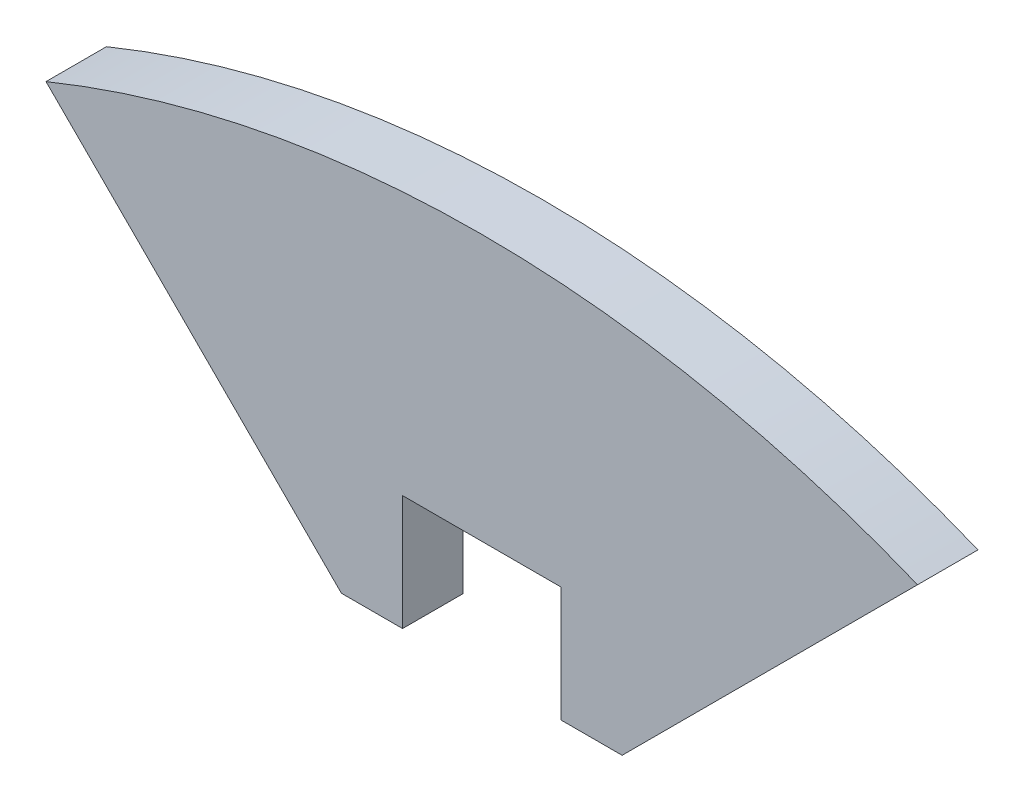
ISO-10303-21;
HEADER;
FILE_DESCRIPTION(('STEP AP214'),'2;1');
FILE_NAME('part.step','',(''),(''),'','','');
FILE_SCHEMA(('AUTOMOTIVE_DESIGN { 1 0 10303 214 1 1 1 1 }'));
ENDSEC;
DATA;
#1=APPLICATION_CONTEXT('core data for automotive mechanical design processes');
#2=APPLICATION_PROTOCOL_DEFINITION('international standard','automotive_design',2000,#1);
#3=PRODUCT_CONTEXT('',#1,'mechanical');
#4=PRODUCT('Part','Part','',(#3));
#5=PRODUCT_RELATED_PRODUCT_CATEGORY('part','',(#4));
#6=PRODUCT_DEFINITION_FORMATION('','',#4);
#7=PRODUCT_DEFINITION_CONTEXT('part definition',#1,'design');
#8=PRODUCT_DEFINITION('design','',#6,#7);
#9=PRODUCT_DEFINITION_SHAPE('','',#8);
#10=(LENGTH_UNIT() NAMED_UNIT(*) SI_UNIT(.MILLI.,.METRE.));
#11=(NAMED_UNIT(*) PLANE_ANGLE_UNIT() SI_UNIT($,.RADIAN.));
#12=(NAMED_UNIT(*) SI_UNIT($,.STERADIAN.) SOLID_ANGLE_UNIT());
#13=UNCERTAINTY_MEASURE_WITH_UNIT(LENGTH_MEASURE(1.E-05),#10,'distance_accuracy_value','');
#14=(GEOMETRIC_REPRESENTATION_CONTEXT(3) GLOBAL_UNCERTAINTY_ASSIGNED_CONTEXT((#13)) GLOBAL_UNIT_ASSIGNED_CONTEXT((#10,
#11,#12)) REPRESENTATION_CONTEXT('',''));
#15=CARTESIAN_POINT('',(0.,0.,0.));
#16=DIRECTION('',(0.,0.,1.));
#17=DIRECTION('',(1.,0.,0.));
#18=AXIS2_PLACEMENT_3D('',#15,#16,#17);
#19=CARTESIAN_POINT('',(0.,0.,0.));
#20=DIRECTION('',(0.,0.,1.));
#21=DIRECTION('',(1.,0.,0.));
#22=AXIS2_PLACEMENT_3D('',#19,#20,#21);
#23=PLANE('',#22);
#24=DIRECTION('',(-0.707106781186543,-0.707106781186552,0.));
#25=VECTOR('',#24,1.);
#26=CARTESIAN_POINT('',(4.87500000000006,-4.875,0.));
#27=LINE('',#26,#25);
#28=CARTESIAN_POINT('',(20.0101193950167,10.2601193950169,0.));
#29=VERTEX_POINT('',#28);
#30=CARTESIAN_POINT('',(9.75,0.,0.));
#31=VERTEX_POINT('',#30);
#32=EDGE_CURVE('E83',#29,#31,#27,.T.);
#33=ORIENTED_EDGE('',*,*,#32,.T.);
#34=DIRECTION('',(1.,0.,0.));
#35=VECTOR('',#34,1.);
#36=CARTESIAN_POINT('',(0.,0.,0.));
#37=LINE('',#36,#35);
#38=CARTESIAN_POINT('',(7.625,0.,0.));
#39=VERTEX_POINT('',#38);
#40=EDGE_CURVE('E111',#31,#39,#37,.F.);
#41=ORIENTED_EDGE('',*,*,#40,.T.);
#42=DIRECTION('',(0.,1.,0.));
#43=VECTOR('',#42,1.);
#44=CARTESIAN_POINT('',(7.625,0.,0.));
#45=LINE('',#44,#43);
#46=CARTESIAN_POINT('',(7.625,4.,0.));
#47=VERTEX_POINT('',#46);
#48=EDGE_CURVE('E117',#39,#47,#45,.T.);
#49=ORIENTED_EDGE('',*,*,#48,.T.);
#50=DIRECTION('',(1.,0.,0.));
#51=VECTOR('',#50,1.);
#52=CARTESIAN_POINT('',(0.,4.,0.));
#53=LINE('',#52,#51);
#54=CARTESIAN_POINT('',(2.125,4.,0.));
#55=VERTEX_POINT('',#54);
#56=EDGE_CURVE('E124',#47,#55,#53,.F.);
#57=ORIENTED_EDGE('',*,*,#56,.T.);
#58=DIRECTION('',(0.,1.,0.));
#59=VECTOR('',#58,1.);
#60=CARTESIAN_POINT('',(2.125,0.,0.));
#61=LINE('',#60,#59);
#62=CARTESIAN_POINT('',(2.125,0.,0.));
#63=VERTEX_POINT('',#62);
#64=EDGE_CURVE('E131',#55,#63,#61,.F.);
#65=ORIENTED_EDGE('',*,*,#64,.T.);
#66=DIRECTION('',(1.,0.,0.));
#67=VECTOR('',#66,1.);
#68=CARTESIAN_POINT('',(0.,0.,0.));
#69=LINE('',#68,#67);
#70=CARTESIAN_POINT('',(0.,0.,0.));
#71=VERTEX_POINT('',#70);
#72=EDGE_CURVE('E138',#63,#71,#69,.F.);
#73=ORIENTED_EDGE('',*,*,#72,.T.);
#74=DIRECTION('',(0.707106781186551,-0.707106781186544,0.));
#75=VECTOR('',#74,1.);
#76=CARTESIAN_POINT('',(0.,0.,0.));
#77=LINE('',#76,#75);
#78=CARTESIAN_POINT('',(-10.2601193950169,10.2601193950168,0.));
#79=VERTEX_POINT('',#78);
#80=EDGE_CURVE('E85',#79,#71,#77,.T.);
#81=ORIENTED_EDGE('',*,*,#80,.F.);
#82=CARTESIAN_POINT('',(4.87500000000008,-26.7659276651081,0.));
#83=DIRECTION('',(0.,0.,-1.));
#84=DIRECTION('',(-1.,0.,0.));
#85=AXIS2_PLACEMENT_3D('',#82,#83,#84);
#86=CIRCLE('',#85,40.);
#87=EDGE_CURVE('E19',#29,#79,#86,.F.);
#88=ORIENTED_EDGE('',*,*,#87,.F.);
#89=EDGE_LOOP('',(#33,#41,#49,#57,#65,#73,#81,#88));
#90=FACE_BOUND('',#89,.T.);
#91=ADVANCED_FACE('F16',(#90),#23,.F.);
#92=CARTESIAN_POINT('',(4.87500000000008,-26.7659276651081,2.1));
#93=DIRECTION('',(0.,0.,-1.));
#94=DIRECTION('',(-1.,0.,0.));
#95=AXIS2_PLACEMENT_3D('',#92,#93,#94);
#96=CYLINDRICAL_SURFACE('',#95,40.);
#97=CARTESIAN_POINT('',(4.87500000000008,-26.7659276651081,2.1));
#98=DIRECTION('',(0.,0.,-1.));
#99=DIRECTION('',(-1.,0.,0.));
#100=AXIS2_PLACEMENT_3D('',#97,#98,#99);
#101=CIRCLE('',#100,40.);
#102=CARTESIAN_POINT('',(20.0101193950167,10.2601193950169,2.1));
#103=VERTEX_POINT('',#102);
#104=CARTESIAN_POINT('',(-10.2601193950169,10.2601193950167,2.1));
#105=VERTEX_POINT('',#104);
#106=EDGE_CURVE('E93',#103,#105,#101,.F.);
#107=ORIENTED_EDGE('',*,*,#106,.F.);
#108=DIRECTION('',(0.,0.,1.));
#109=VECTOR('',#108,1.);
#110=CARTESIAN_POINT('',(20.0101193950167,10.2601193950169,2.1));
#111=LINE('',#110,#109);
#112=EDGE_CURVE('E90',#103,#29,#111,.F.);
#113=ORIENTED_EDGE('',*,*,#112,.T.);
#114=ORIENTED_EDGE('',*,*,#87,.T.);
#115=DIRECTION('',(0.,0.,1.));
#116=VECTOR('',#115,1.);
#117=CARTESIAN_POINT('',(-10.2601193950169,10.2601193950167,2.1));
#118=LINE('',#117,#116);
#119=EDGE_CURVE('E107',#105,#79,#118,.F.);
#120=ORIENTED_EDGE('',*,*,#119,.F.);
#121=EDGE_LOOP('',(#107,#113,#114,#120));
#122=FACE_BOUND('',#121,.T.);
#123=ADVANCED_FACE('F91',(#122),#96,.T.);
#124=CARTESIAN_POINT('',(0.,0.,2.1));
#125=DIRECTION('',(-0.707106781186544,-0.707106781186551,0.));
#126=DIRECTION('',(0.707106781186551,-0.707106781186544,0.));
#127=AXIS2_PLACEMENT_3D('',#124,#125,#126);
#128=PLANE('',#127);
#129=DIRECTION('',(0.707106781186554,-0.707106781186541,0.));
#130=VECTOR('',#129,1.);
#131=CARTESIAN_POINT('',(-10.2601193950169,10.2601193950167,2.1));
#132=LINE('',#131,#130);
#133=CARTESIAN_POINT('',(0.,0.,2.1));
#134=VERTEX_POINT('',#133);
#135=EDGE_CURVE('E104',#105,#134,#132,.T.);
#136=ORIENTED_EDGE('',*,*,#135,.F.);
#137=ORIENTED_EDGE('',*,*,#119,.T.);
#138=ORIENTED_EDGE('',*,*,#80,.T.);
#139=DIRECTION('',(0.,0.,1.));
#140=VECTOR('',#139,1.);
#141=CARTESIAN_POINT('',(0.,0.,2.1));
#142=LINE('',#141,#140);
#143=EDGE_CURVE('E141',#71,#134,#142,.T.);
#144=ORIENTED_EDGE('',*,*,#143,.T.);
#145=EDGE_LOOP('',(#136,#137,#138,#144));
#146=FACE_BOUND('',#145,.T.);
#147=ADVANCED_FACE('F211',(#146),#128,.T.);
#148=CARTESIAN_POINT('',(0.,0.,2.1));
#149=DIRECTION('',(0.,1.,0.));
#150=DIRECTION('',(0.,0.,1.));
#151=AXIS2_PLACEMENT_3D('',#148,#149,#150);
#152=PLANE('',#151);
#153=DIRECTION('',(0.,0.,1.));
#154=VECTOR('',#153,1.);
#155=CARTESIAN_POINT('',(2.125,0.,2.1));
#156=LINE('',#155,#154);
#157=CARTESIAN_POINT('',(2.125,0.,2.1));
#158=VERTEX_POINT('',#157);
#159=EDGE_CURVE('E135',#63,#158,#156,.T.);
#160=ORIENTED_EDGE('',*,*,#159,.T.);
#161=DIRECTION('',(1.,0.,0.));
#162=VECTOR('',#161,1.);
#163=CARTESIAN_POINT('',(0.,0.,2.1));
#164=LINE('',#163,#162);
#165=EDGE_CURVE('E160',#134,#158,#164,.T.);
#166=ORIENTED_EDGE('',*,*,#165,.F.);
#167=ORIENTED_EDGE('',*,*,#143,.F.);
#168=ORIENTED_EDGE('',*,*,#72,.F.);
#169=EDGE_LOOP('',(#160,#166,#167,#168));
#170=FACE_BOUND('',#169,.T.);
#171=ADVANCED_FACE('F213',(#170),#152,.F.);
#172=CARTESIAN_POINT('',(2.125,0.,2.1));
#173=DIRECTION('',(-1.,0.,0.));
#174=DIRECTION('',(0.,0.,1.));
#175=AXIS2_PLACEMENT_3D('',#172,#173,#174);
#176=PLANE('',#175);
#177=DIRECTION('',(0.,0.,1.));
#178=VECTOR('',#177,1.);
#179=CARTESIAN_POINT('',(2.125,4.,2.1));
#180=LINE('',#179,#178);
#181=CARTESIAN_POINT('',(2.125,4.,2.1));
#182=VERTEX_POINT('',#181);
#183=EDGE_CURVE('E128',#55,#182,#180,.T.);
#184=ORIENTED_EDGE('',*,*,#183,.T.);
#185=DIRECTION('',(0.,1.,0.));
#186=VECTOR('',#185,1.);
#187=CARTESIAN_POINT('',(2.125,0.,2.1));
#188=LINE('',#187,#186);
#189=EDGE_CURVE('E164',#158,#182,#188,.T.);
#190=ORIENTED_EDGE('',*,*,#189,.F.);
#191=ORIENTED_EDGE('',*,*,#159,.F.);
#192=ORIENTED_EDGE('',*,*,#64,.F.);
#193=EDGE_LOOP('',(#184,#190,#191,#192));
#194=FACE_BOUND('',#193,.T.);
#195=ADVANCED_FACE('F220',(#194),#176,.F.);
#196=CARTESIAN_POINT('',(0.,4.,2.1));
#197=DIRECTION('',(0.,1.,0.));
#198=DIRECTION('',(0.,0.,1.));
#199=AXIS2_PLACEMENT_3D('',#196,#197,#198);
#200=PLANE('',#199);
#201=DIRECTION('',(0.,0.,1.));
#202=VECTOR('',#201,1.);
#203=CARTESIAN_POINT('',(7.625,4.,2.1));
#204=LINE('',#203,#202);
#205=CARTESIAN_POINT('',(7.625,4.,2.1));
#206=VERTEX_POINT('',#205);
#207=EDGE_CURVE('E121',#47,#206,#204,.T.);
#208=ORIENTED_EDGE('',*,*,#207,.T.);
#209=DIRECTION('',(1.,0.,0.));
#210=VECTOR('',#209,1.);
#211=CARTESIAN_POINT('',(0.,4.,2.1));
#212=LINE('',#211,#210);
#213=EDGE_CURVE('E173',#182,#206,#212,.T.);
#214=ORIENTED_EDGE('',*,*,#213,.F.);
#215=ORIENTED_EDGE('',*,*,#183,.F.);
#216=ORIENTED_EDGE('',*,*,#56,.F.);
#217=EDGE_LOOP('',(#208,#214,#215,#216));
#218=FACE_BOUND('',#217,.T.);
#219=ADVANCED_FACE('F236',(#218),#200,.F.);
#220=CARTESIAN_POINT('',(7.625,0.,2.1));
#221=DIRECTION('',(1.,0.,0.));
#222=DIRECTION('',(0.,1.,0.));
#223=AXIS2_PLACEMENT_3D('',#220,#221,#222);
#224=PLANE('',#223);
#225=DIRECTION('',(0.,0.,1.));
#226=VECTOR('',#225,1.);
#227=CARTESIAN_POINT('',(7.625,0.,2.1));
#228=LINE('',#227,#226);
#229=CARTESIAN_POINT('',(7.625,0.,2.1));
#230=VERTEX_POINT('',#229);
#231=EDGE_CURVE('E114',#39,#230,#228,.T.);
#232=ORIENTED_EDGE('',*,*,#231,.T.);
#233=DIRECTION('',(0.,1.,0.));
#234=VECTOR('',#233,1.);
#235=CARTESIAN_POINT('',(7.625,0.,2.1));
#236=LINE('',#235,#234);
#237=EDGE_CURVE('E183',#206,#230,#236,.F.);
#238=ORIENTED_EDGE('',*,*,#237,.F.);
#239=ORIENTED_EDGE('',*,*,#207,.F.);
#240=ORIENTED_EDGE('',*,*,#48,.F.);
#241=EDGE_LOOP('',(#232,#238,#239,#240));
#242=FACE_BOUND('',#241,.T.);
#243=ADVANCED_FACE('F233',(#242),#224,.F.);
#244=CARTESIAN_POINT('',(0.,0.,2.1));
#245=DIRECTION('',(0.,1.,0.));
#246=DIRECTION('',(0.,0.,1.));
#247=AXIS2_PLACEMENT_3D('',#244,#245,#246);
#248=PLANE('',#247);
#249=DIRECTION('',(0.,0.,1.));
#250=VECTOR('',#249,1.);
#251=CARTESIAN_POINT('',(9.75,0.,2.1));
#252=LINE('',#251,#250);
#253=CARTESIAN_POINT('',(9.75,0.,2.1));
#254=VERTEX_POINT('',#253);
#255=EDGE_CURVE('E35',#31,#254,#252,.T.);
#256=ORIENTED_EDGE('',*,*,#255,.T.);
#257=DIRECTION('',(1.,0.,0.));
#258=VECTOR('',#257,1.);
#259=CARTESIAN_POINT('',(0.,0.,2.1));
#260=LINE('',#259,#258);
#261=EDGE_CURVE('E26',#230,#254,#260,.T.);
#262=ORIENTED_EDGE('',*,*,#261,.F.);
#263=ORIENTED_EDGE('',*,*,#231,.F.);
#264=ORIENTED_EDGE('',*,*,#40,.F.);
#265=EDGE_LOOP('',(#256,#262,#263,#264));
#266=FACE_BOUND('',#265,.T.);
#267=ADVANCED_FACE('F228',(#266),#248,.F.);
#268=CARTESIAN_POINT('',(4.87500000000006,-4.875,2.1));
#269=DIRECTION('',(-0.707106781186552,0.707106781186543,0.));
#270=DIRECTION('',(-0.707106781186543,-0.707106781186552,0.));
#271=AXIS2_PLACEMENT_3D('',#268,#269,#270);
#272=PLANE('',#271);
#273=ORIENTED_EDGE('',*,*,#112,.F.);
#274=DIRECTION('',(0.707106781186541,0.707106781186554,0.));
#275=VECTOR('',#274,1.);
#276=CARTESIAN_POINT('',(9.75,0.,2.1));
#277=LINE('',#276,#275);
#278=EDGE_CURVE('E11',#254,#103,#277,.T.);
#279=ORIENTED_EDGE('',*,*,#278,.F.);
#280=ORIENTED_EDGE('',*,*,#255,.F.);
#281=ORIENTED_EDGE('',*,*,#32,.F.);
#282=EDGE_LOOP('',(#273,#279,#280,#281));
#283=FACE_BOUND('',#282,.T.);
#284=ADVANCED_FACE('F97',(#283),#272,.F.);
#285=CARTESIAN_POINT('',(0.,0.,2.1));
#286=DIRECTION('',(0.,0.,1.));
#287=DIRECTION('',(1.,0.,0.));
#288=AXIS2_PLACEMENT_3D('',#285,#286,#287);
#289=PLANE('',#288);
#290=ORIENTED_EDGE('',*,*,#261,.T.);
#291=ORIENTED_EDGE('',*,*,#278,.T.);
#292=ORIENTED_EDGE('',*,*,#106,.T.);
#293=ORIENTED_EDGE('',*,*,#135,.T.);
#294=ORIENTED_EDGE('',*,*,#165,.T.);
#295=ORIENTED_EDGE('',*,*,#189,.T.);
#296=ORIENTED_EDGE('',*,*,#213,.T.);
#297=ORIENTED_EDGE('',*,*,#237,.T.);
#298=EDGE_LOOP('',(#290,#291,#292,#293,#294,#295,#296,#297));
#299=FACE_BOUND('',#298,.T.);
#300=ADVANCED_FACE('F210',(#299),#289,.T.);
#301=CLOSED_SHELL('',(#91,#123,#147,#171,#195,#219,#243,#267,#284,#300));
#302=MANIFOLD_SOLID_BREP('B1',#301);
#303=ADVANCED_BREP_SHAPE_REPRESENTATION('',(#18,#302),#14);
#304=SHAPE_DEFINITION_REPRESENTATION(#9,#303);
ENDSEC;
END-ISO-10303-21;
